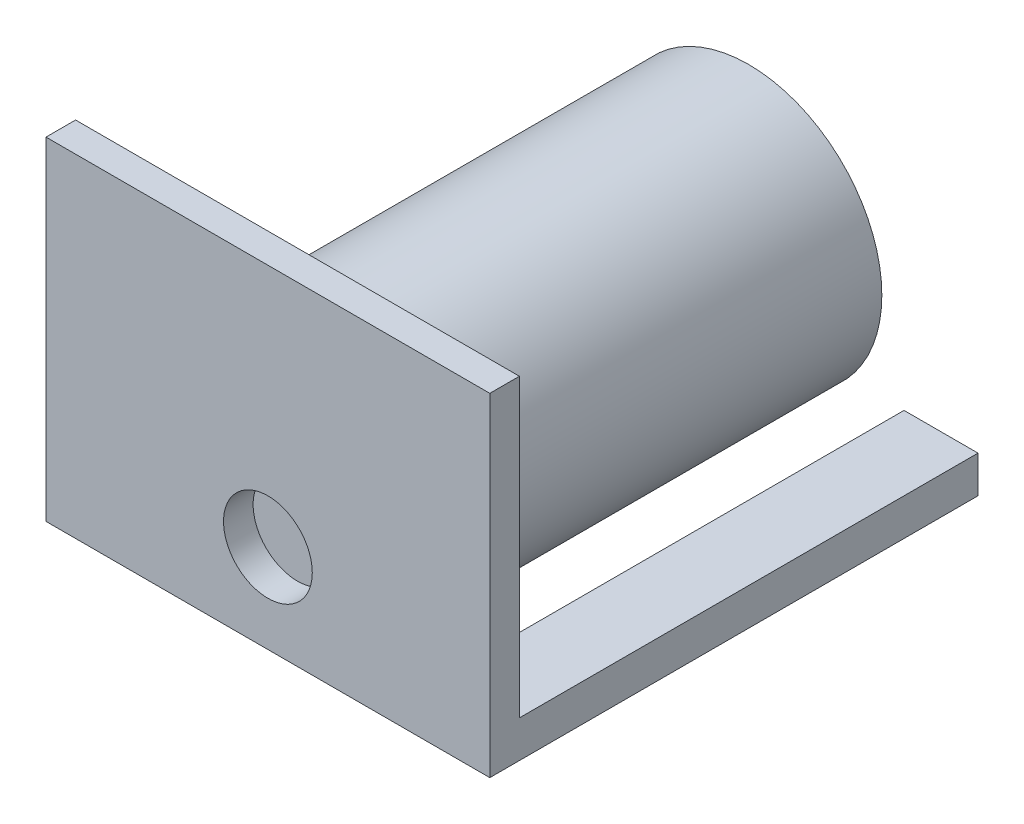
ISO-10303-21;
HEADER;
FILE_DESCRIPTION(('STEP AP214'),'2;1');
FILE_NAME('part.step','',(''),(''),'','','');
FILE_SCHEMA(('AUTOMOTIVE_DESIGN { 1 0 10303 214 1 1 1 1 }'));
ENDSEC;
DATA;
#1=APPLICATION_CONTEXT('core data for automotive mechanical design processes');
#2=APPLICATION_PROTOCOL_DEFINITION('international standard','automotive_design',2000,#1);
#3=PRODUCT_CONTEXT('',#1,'mechanical');
#4=PRODUCT('Part','Part','',(#3));
#5=PRODUCT_RELATED_PRODUCT_CATEGORY('part','',(#4));
#6=PRODUCT_DEFINITION_FORMATION('','',#4);
#7=PRODUCT_DEFINITION_CONTEXT('part definition',#1,'design');
#8=PRODUCT_DEFINITION('design','',#6,#7);
#9=PRODUCT_DEFINITION_SHAPE('','',#8);
#10=(LENGTH_UNIT() NAMED_UNIT(*) SI_UNIT(.MILLI.,.METRE.));
#11=(NAMED_UNIT(*) PLANE_ANGLE_UNIT() SI_UNIT($,.RADIAN.));
#12=(NAMED_UNIT(*) SI_UNIT($,.STERADIAN.) SOLID_ANGLE_UNIT());
#13=UNCERTAINTY_MEASURE_WITH_UNIT(LENGTH_MEASURE(1.E-05),#10,'distance_accuracy_value','');
#14=(GEOMETRIC_REPRESENTATION_CONTEXT(3) GLOBAL_UNCERTAINTY_ASSIGNED_CONTEXT((#13)) GLOBAL_UNIT_ASSIGNED_CONTEXT((#10,
#11,#12)) REPRESENTATION_CONTEXT('',''));
#15=CARTESIAN_POINT('',(0.,0.,0.));
#16=DIRECTION('',(0.,0.,1.));
#17=DIRECTION('',(1.,0.,0.));
#18=AXIS2_PLACEMENT_3D('',#15,#16,#17);
#19=CARTESIAN_POINT('',(0.58987661016754,-4.08957470949796,-22.323464202521));
#20=DIRECTION('',(0.,0.,1.));
#21=DIRECTION('',(1.,0.,0.));
#22=AXIS2_PLACEMENT_3D('',#19,#20,#21);
#23=PLANE('',#22);
#24=DIRECTION('',(1.,0.,0.));
#25=VECTOR('',#24,1.);
#26=CARTESIAN_POINT('',(-3.80602751744995,-7.42583689262255,-22.323464202521));
#27=LINE('',#26,#25);
#28=CARTESIAN_POINT('',(0.693972482550047,-7.42583689262255,-22.323464202521));
#29=VERTEX_POINT('',#28);
#30=CARTESIAN_POINT('',(3.69397248255005,-7.42583689262255,-22.323464202521));
#31=VERTEX_POINT('',#30);
#32=EDGE_CURVE('E58',#29,#31,#27,.T.);
#33=ORIENTED_EDGE('',*,*,#32,.F.);
#34=CARTESIAN_POINT('',(0.693972482550047,-4.72583689262255,-22.323464202521));
#35=DIRECTION('',(0.,0.,-1.));
#36=DIRECTION('',(-1.,0.,0.));
#37=AXIS2_PLACEMENT_3D('',#34,#35,#36);
#38=CIRCLE('',#37,2.7);
#39=EDGE_CURVE('E123',#29,#29,#38,.T.);
#40=ORIENTED_EDGE('',*,*,#39,.F.);
#41=CARTESIAN_POINT('',(-2.30602751744995,-7.42583689262255,-22.323464202521));
#42=VERTEX_POINT('',#41);
#43=EDGE_CURVE('E115',#42,#29,#27,.T.);
#44=ORIENTED_EDGE('',*,*,#43,.F.);
#45=DIRECTION('',(0.,-1.,0.));
#46=VECTOR('',#45,1.);
#47=CARTESIAN_POINT('',(-2.30602751744995,-7.42583689262255,-22.323464202521));
#48=LINE('',#47,#46);
#49=CARTESIAN_POINT('',(-2.30602751744995,-6.67583689262255,-22.323464202521));
#50=VERTEX_POINT('',#49);
#51=EDGE_CURVE('E214',#50,#42,#48,.T.);
#52=ORIENTED_EDGE('',*,*,#51,.F.);
#53=DIRECTION('',(1.,0.,0.));
#54=VECTOR('',#53,1.);
#55=CARTESIAN_POINT('',(-3.80602751744995,-6.67583689262255,-22.323464202521));
#56=LINE('',#55,#54);
#57=CARTESIAN_POINT('',(-3.80602751744995,-6.67583689262255,-22.323464202521));
#58=VERTEX_POINT('',#57);
#59=EDGE_CURVE('E212',#58,#50,#56,.T.);
#60=ORIENTED_EDGE('',*,*,#59,.F.);
#61=DIRECTION('',(0.,-1.,0.));
#62=VECTOR('',#61,1.);
#63=CARTESIAN_POINT('',(-3.80602751744996,-0.675836892622552,-22.323464202521));
#64=LINE('',#63,#62);
#65=CARTESIAN_POINT('',(-3.80602751744996,-0.675836892622552,-22.323464202521));
#66=VERTEX_POINT('',#65);
#67=EDGE_CURVE('E127',#66,#58,#64,.T.);
#68=ORIENTED_EDGE('',*,*,#67,.F.);
#69=DIRECTION('',(-1.,0.,0.));
#70=VECTOR('',#69,1.);
#71=CARTESIAN_POINT('',(-3.80602751744996,-0.675836892622552,-22.323464202521));
#72=LINE('',#71,#70);
#73=CARTESIAN_POINT('',(5.19397248255005,-0.675836892622552,-22.323464202521));
#74=VERTEX_POINT('',#73);
#75=EDGE_CURVE('E134',#74,#66,#72,.T.);
#76=ORIENTED_EDGE('',*,*,#75,.F.);
#77=DIRECTION('',(0.,1.,0.));
#78=VECTOR('',#77,1.);
#79=CARTESIAN_POINT('',(5.19397248255005,-0.675836892622552,-22.323464202521));
#80=LINE('',#79,#78);
#81=CARTESIAN_POINT('',(5.19397248255005,-6.67583689262255,-22.323464202521));
#82=VERTEX_POINT('',#81);
#83=EDGE_CURVE('E120',#82,#74,#80,.T.);
#84=ORIENTED_EDGE('',*,*,#83,.F.);
#85=DIRECTION('',(1.,0.,0.));
#86=VECTOR('',#85,1.);
#87=CARTESIAN_POINT('',(5.19397248255005,-6.67583689262255,-22.323464202521));
#88=LINE('',#87,#86);
#89=CARTESIAN_POINT('',(3.69397248255005,-6.67583689262255,-22.323464202521));
#90=VERTEX_POINT('',#89);
#91=EDGE_CURVE('E163',#90,#82,#88,.T.);
#92=ORIENTED_EDGE('',*,*,#91,.F.);
#93=DIRECTION('',(0.,1.,0.));
#94=VECTOR('',#93,1.);
#95=CARTESIAN_POINT('',(3.69397248255005,-7.42583689262255,-22.323464202521));
#96=LINE('',#95,#94);
#97=EDGE_CURVE('E125',#31,#90,#96,.T.);
#98=ORIENTED_EDGE('',*,*,#97,.F.);
#99=EDGE_LOOP('',(#33,#40,#44,#52,#60,#68,#76,#84,#92,#98));
#100=FACE_BOUND('',#99,.T.);
#101=ADVANCED_FACE('F37',(#100),#23,.F.);
#102=CARTESIAN_POINT('',(-3.80602751744996,-0.675836892622552,-21.723464202521));
#103=DIRECTION('',(1.,0.,0.));
#104=DIRECTION('',(0.,1.,0.));
#105=AXIS2_PLACEMENT_3D('',#102,#103,#104);
#106=PLANE('',#105);
#107=ORIENTED_EDGE('',*,*,#67,.T.);
#108=DIRECTION('',(0.,0.,1.));
#109=VECTOR('',#108,1.);
#110=CARTESIAN_POINT('',(-3.80602751744995,-6.67583689262255,-31.623464202521));
#111=LINE('',#110,#109);
#112=CARTESIAN_POINT('',(-3.80602751744995,-6.67583689262255,-31.623464202521));
#113=VERTEX_POINT('',#112);
#114=EDGE_CURVE('E168',#113,#58,#111,.T.);
#115=ORIENTED_EDGE('',*,*,#114,.F.);
#116=DIRECTION('',(0.,1.,0.));
#117=VECTOR('',#116,1.);
#118=CARTESIAN_POINT('',(-3.80602751744995,-7.42583689262255,-31.623464202521));
#119=LINE('',#118,#117);
#120=CARTESIAN_POINT('',(-3.80602751744995,-7.42583689262255,-31.623464202521));
#121=VERTEX_POINT('',#120);
#122=EDGE_CURVE('E198',#121,#113,#119,.T.);
#123=ORIENTED_EDGE('',*,*,#122,.F.);
#124=DIRECTION('',(0.,0.,-1.));
#125=VECTOR('',#124,1.);
#126=CARTESIAN_POINT('',(-3.80602751744995,-7.42583689262255,-21.723464202521));
#127=LINE('',#126,#125);
#128=CARTESIAN_POINT('',(-3.80602751744995,-7.42583689262255,-21.723464202521));
#129=VERTEX_POINT('',#128);
#130=EDGE_CURVE('E11',#129,#121,#127,.T.);
#131=ORIENTED_EDGE('',*,*,#130,.F.);
#132=DIRECTION('',(0.,-1.,0.));
#133=VECTOR('',#132,1.);
#134=CARTESIAN_POINT('',(-3.80602751744996,-0.675836892622552,-21.723464202521));
#135=LINE('',#134,#133);
#136=CARTESIAN_POINT('',(-3.80602751744996,-0.675836892622552,-21.723464202521));
#137=VERTEX_POINT('',#136);
#138=EDGE_CURVE('E136',#137,#129,#135,.T.);
#139=ORIENTED_EDGE('',*,*,#138,.F.);
#140=DIRECTION('',(0.,0.,-1.));
#141=VECTOR('',#140,1.);
#142=CARTESIAN_POINT('',(-3.80602751744996,-0.675836892622552,-21.723464202521));
#143=LINE('',#142,#141);
#144=EDGE_CURVE('E137',#137,#66,#143,.T.);
#145=ORIENTED_EDGE('',*,*,#144,.T.);
#146=EDGE_LOOP('',(#107,#115,#123,#131,#139,#145));
#147=FACE_BOUND('',#146,.T.);
#148=ADVANCED_FACE('F39',(#147),#106,.F.);
#149=CARTESIAN_POINT('',(-3.80602751744995,-7.42583689262255,-21.723464202521));
#150=DIRECTION('',(0.,1.,0.));
#151=DIRECTION('',(0.,0.,1.));
#152=AXIS2_PLACEMENT_3D('',#149,#150,#151);
#153=PLANE('',#152);
#154=ORIENTED_EDGE('',*,*,#130,.T.);
#155=DIRECTION('',(-1.,0.,0.));
#156=VECTOR('',#155,1.);
#157=CARTESIAN_POINT('',(-3.80602751744995,-7.42583689262255,-31.623464202521));
#158=LINE('',#157,#156);
#159=CARTESIAN_POINT('',(-2.30602751744995,-7.42583689262255,-31.623464202521));
#160=VERTEX_POINT('',#159);
#161=EDGE_CURVE('E200',#160,#121,#158,.T.);
#162=ORIENTED_EDGE('',*,*,#161,.F.);
#163=DIRECTION('',(0.,0.,1.));
#164=VECTOR('',#163,1.);
#165=CARTESIAN_POINT('',(-2.30602751744995,-7.42583689262255,-31.623464202521));
#166=LINE('',#165,#164);
#167=EDGE_CURVE('E52',#160,#42,#166,.T.);
#168=ORIENTED_EDGE('',*,*,#167,.T.);
#169=ORIENTED_EDGE('',*,*,#43,.T.);
#170=ORIENTED_EDGE('',*,*,#32,.T.);
#171=DIRECTION('',(0.,0.,1.));
#172=VECTOR('',#171,1.);
#173=CARTESIAN_POINT('',(3.69397248255005,-7.42583689262255,-31.623464202521));
#174=LINE('',#173,#172);
#175=CARTESIAN_POINT('',(3.69397248255005,-7.42583689262255,-31.623464202521));
#176=VERTEX_POINT('',#175);
#177=EDGE_CURVE('E129',#176,#31,#174,.T.);
#178=ORIENTED_EDGE('',*,*,#177,.F.);
#179=DIRECTION('',(-1.,0.,0.));
#180=VECTOR('',#179,1.);
#181=CARTESIAN_POINT('',(5.19397248255005,-7.42583689262255,-31.623464202521));
#182=LINE('',#181,#180);
#183=CARTESIAN_POINT('',(5.19397248255005,-7.42583689262255,-31.623464202521));
#184=VERTEX_POINT('',#183);
#185=EDGE_CURVE('E154',#184,#176,#182,.T.);
#186=ORIENTED_EDGE('',*,*,#185,.F.);
#187=DIRECTION('',(0.,0.,-1.));
#188=VECTOR('',#187,1.);
#189=CARTESIAN_POINT('',(5.19397248255005,-7.42583689262255,-21.723464202521));
#190=LINE('',#189,#188);
#191=CARTESIAN_POINT('',(5.19397248255005,-7.42583689262255,-21.723464202521));
#192=VERTEX_POINT('',#191);
#193=EDGE_CURVE('E45',#192,#184,#190,.T.);
#194=ORIENTED_EDGE('',*,*,#193,.F.);
#195=DIRECTION('',(1.,0.,0.));
#196=VECTOR('',#195,1.);
#197=CARTESIAN_POINT('',(-3.80602751744995,-7.42583689262255,-21.723464202521));
#198=LINE('',#197,#196);
#199=EDGE_CURVE('E182',#129,#192,#198,.T.);
#200=ORIENTED_EDGE('',*,*,#199,.F.);
#201=EDGE_LOOP('',(#154,#162,#168,#169,#170,#178,#186,#194,#200));
#202=FACE_BOUND('',#201,.T.);
#203=ADVANCED_FACE('F116',(#202),#153,.F.);
#204=CARTESIAN_POINT('',(5.19397248255005,-0.675836892622552,-21.723464202521));
#205=DIRECTION('',(-1.,0.,0.));
#206=DIRECTION('',(0.,-1.,0.));
#207=AXIS2_PLACEMENT_3D('',#204,#205,#206);
#208=PLANE('',#207);
#209=ORIENTED_EDGE('',*,*,#193,.T.);
#210=DIRECTION('',(0.,-1.,0.));
#211=VECTOR('',#210,1.);
#212=CARTESIAN_POINT('',(5.19397248255005,-7.42583689262255,-31.623464202521));
#213=LINE('',#212,#211);
#214=CARTESIAN_POINT('',(5.19397248255005,-6.67583689262255,-31.623464202521));
#215=VERTEX_POINT('',#214);
#216=EDGE_CURVE('E151',#215,#184,#213,.T.);
#217=ORIENTED_EDGE('',*,*,#216,.F.);
#218=DIRECTION('',(0.,0.,1.));
#219=VECTOR('',#218,1.);
#220=CARTESIAN_POINT('',(5.19397248255005,-6.67583689262255,-31.623464202521));
#221=LINE('',#220,#219);
#222=EDGE_CURVE('E173',#215,#82,#221,.T.);
#223=ORIENTED_EDGE('',*,*,#222,.T.);
#224=ORIENTED_EDGE('',*,*,#83,.T.);
#225=DIRECTION('',(0.,0.,-1.));
#226=VECTOR('',#225,1.);
#227=CARTESIAN_POINT('',(5.19397248255005,-0.675836892622552,-21.723464202521));
#228=LINE('',#227,#226);
#229=CARTESIAN_POINT('',(5.19397248255005,-0.675836892622552,-21.723464202521));
#230=VERTEX_POINT('',#229);
#231=EDGE_CURVE('E140',#230,#74,#228,.T.);
#232=ORIENTED_EDGE('',*,*,#231,.F.);
#233=DIRECTION('',(0.,1.,0.));
#234=VECTOR('',#233,1.);
#235=CARTESIAN_POINT('',(5.19397248255005,-0.675836892622552,-21.723464202521));
#236=LINE('',#235,#234);
#237=EDGE_CURVE('E153',#192,#230,#236,.T.);
#238=ORIENTED_EDGE('',*,*,#237,.F.);
#239=EDGE_LOOP('',(#209,#217,#223,#224,#232,#238));
#240=FACE_BOUND('',#239,.T.);
#241=ADVANCED_FACE('F148',(#240),#208,.F.);
#242=CARTESIAN_POINT('',(-3.80602751744996,-0.675836892622552,-21.723464202521));
#243=DIRECTION('',(0.,-1.,0.));
#244=DIRECTION('',(0.,0.,-1.));
#245=AXIS2_PLACEMENT_3D('',#242,#243,#244);
#246=PLANE('',#245);
#247=ORIENTED_EDGE('',*,*,#75,.T.);
#248=ORIENTED_EDGE('',*,*,#144,.F.);
#249=DIRECTION('',(-1.,0.,0.));
#250=VECTOR('',#249,1.);
#251=CARTESIAN_POINT('',(-3.80602751744996,-0.675836892622552,-21.723464202521));
#252=LINE('',#251,#250);
#253=EDGE_CURVE('E141',#230,#137,#252,.T.);
#254=ORIENTED_EDGE('',*,*,#253,.F.);
#255=ORIENTED_EDGE('',*,*,#231,.T.);
#256=EDGE_LOOP('',(#247,#248,#254,#255));
#257=FACE_BOUND('',#256,.T.);
#258=ADVANCED_FACE('F191',(#257),#246,.F.);
#259=CARTESIAN_POINT('',(0.58987661016754,-4.08957470949796,-21.723464202521));
#260=DIRECTION('',(0.,0.,1.));
#261=DIRECTION('',(1.,0.,0.));
#262=AXIS2_PLACEMENT_3D('',#259,#260,#261);
#263=PLANE('',#262);
#264=CARTESIAN_POINT('',(0.693972482550047,-5.62583689262255,-21.723464202521));
#265=DIRECTION('',(0.,0.,1.));
#266=DIRECTION('',(1.,0.,0.));
#267=AXIS2_PLACEMENT_3D('',#264,#265,#266);
#268=CIRCLE('',#267,0.9);
#269=CARTESIAN_POINT('',(1.59397248255005,-5.62583689262255,-21.723464202521));
#270=VERTEX_POINT('',#269);
#271=EDGE_CURVE('E350',#270,#270,#268,.T.);
#272=ORIENTED_EDGE('',*,*,#271,.F.);
#273=EDGE_LOOP('',(#272));
#274=FACE_BOUND('',#273,.T.);
#275=ORIENTED_EDGE('',*,*,#138,.T.);
#276=ORIENTED_EDGE('',*,*,#199,.T.);
#277=ORIENTED_EDGE('',*,*,#237,.T.);
#278=ORIENTED_EDGE('',*,*,#253,.T.);
#279=EDGE_LOOP('',(#275,#276,#277,#278));
#280=FACE_BOUND('',#279,.T.);
#281=ADVANCED_FACE('F187',(#274,#280),#263,.T.);
#282=CARTESIAN_POINT('',(3.69397248255005,-7.42583689262255,-31.623464202521));
#283=DIRECTION('',(1.,0.,0.));
#284=DIRECTION('',(0.,0.,-1.));
#285=AXIS2_PLACEMENT_3D('',#282,#283,#284);
#286=PLANE('',#285);
#287=ORIENTED_EDGE('',*,*,#97,.T.);
#288=DIRECTION('',(0.,0.,1.));
#289=VECTOR('',#288,1.);
#290=CARTESIAN_POINT('',(3.69397248255005,-6.67583689262255,-31.623464202521));
#291=LINE('',#290,#289);
#292=CARTESIAN_POINT('',(3.69397248255005,-6.67583689262255,-31.623464202521));
#293=VERTEX_POINT('',#292);
#294=EDGE_CURVE('E176',#293,#90,#291,.T.);
#295=ORIENTED_EDGE('',*,*,#294,.F.);
#296=DIRECTION('',(0.,1.,0.));
#297=VECTOR('',#296,1.);
#298=CARTESIAN_POINT('',(3.69397248255005,-7.42583689262255,-31.623464202521));
#299=LINE('',#298,#297);
#300=EDGE_CURVE('E157',#176,#293,#299,.T.);
#301=ORIENTED_EDGE('',*,*,#300,.F.);
#302=ORIENTED_EDGE('',*,*,#177,.T.);
#303=EDGE_LOOP('',(#287,#295,#301,#302));
#304=FACE_BOUND('',#303,.T.);
#305=ADVANCED_FACE('F262',(#304),#286,.F.);
#306=CARTESIAN_POINT('',(5.19397248255005,-6.67583689262255,-31.623464202521));
#307=DIRECTION('',(0.,-1.,0.));
#308=DIRECTION('',(0.,0.,-1.));
#309=AXIS2_PLACEMENT_3D('',#306,#307,#308);
#310=PLANE('',#309);
#311=ORIENTED_EDGE('',*,*,#91,.T.);
#312=ORIENTED_EDGE('',*,*,#222,.F.);
#313=DIRECTION('',(1.,0.,0.));
#314=VECTOR('',#313,1.);
#315=CARTESIAN_POINT('',(5.19397248255005,-6.67583689262255,-31.623464202521));
#316=LINE('',#315,#314);
#317=EDGE_CURVE('E161',#293,#215,#316,.T.);
#318=ORIENTED_EDGE('',*,*,#317,.F.);
#319=ORIENTED_EDGE('',*,*,#294,.T.);
#320=EDGE_LOOP('',(#311,#312,#318,#319));
#321=FACE_BOUND('',#320,.T.);
#322=ADVANCED_FACE('F269',(#321),#310,.F.);
#323=CARTESIAN_POINT('',(0.58987661016754,-4.08957470949796,-31.623464202521));
#324=DIRECTION('',(0.,0.,1.));
#325=DIRECTION('',(1.,0.,0.));
#326=AXIS2_PLACEMENT_3D('',#323,#324,#325);
#327=PLANE('',#326);
#328=ORIENTED_EDGE('',*,*,#216,.T.);
#329=ORIENTED_EDGE('',*,*,#185,.T.);
#330=ORIENTED_EDGE('',*,*,#300,.T.);
#331=ORIENTED_EDGE('',*,*,#317,.T.);
#332=EDGE_LOOP('',(#328,#329,#330,#331));
#333=FACE_BOUND('',#332,.T.);
#334=ADVANCED_FACE('F159',(#333),#327,.F.);
#335=CARTESIAN_POINT('',(-3.80602751744995,-6.67583689262255,-31.623464202521));
#336=DIRECTION('',(0.,-1.,0.));
#337=DIRECTION('',(0.,0.,-1.));
#338=AXIS2_PLACEMENT_3D('',#335,#336,#337);
#339=PLANE('',#338);
#340=ORIENTED_EDGE('',*,*,#59,.T.);
#341=DIRECTION('',(0.,0.,1.));
#342=VECTOR('',#341,1.);
#343=CARTESIAN_POINT('',(-2.30602751744995,-6.67583689262255,-31.623464202521));
#344=LINE('',#343,#342);
#345=CARTESIAN_POINT('',(-2.30602751744995,-6.67583689262255,-31.623464202521));
#346=VERTEX_POINT('',#345);
#347=EDGE_CURVE('E206',#346,#50,#344,.T.);
#348=ORIENTED_EDGE('',*,*,#347,.F.);
#349=DIRECTION('',(1.,0.,0.));
#350=VECTOR('',#349,1.);
#351=CARTESIAN_POINT('',(-3.80602751744995,-6.67583689262255,-31.623464202521));
#352=LINE('',#351,#350);
#353=EDGE_CURVE('E208',#113,#346,#352,.T.);
#354=ORIENTED_EDGE('',*,*,#353,.F.);
#355=ORIENTED_EDGE('',*,*,#114,.T.);
#356=EDGE_LOOP('',(#340,#348,#354,#355));
#357=FACE_BOUND('',#356,.T.);
#358=ADVANCED_FACE('F221',(#357),#339,.F.);
#359=CARTESIAN_POINT('',(-2.30602751744995,-7.42583689262255,-31.623464202521));
#360=DIRECTION('',(-1.,0.,0.));
#361=DIRECTION('',(0.,0.,1.));
#362=AXIS2_PLACEMENT_3D('',#359,#360,#361);
#363=PLANE('',#362);
#364=ORIENTED_EDGE('',*,*,#51,.T.);
#365=ORIENTED_EDGE('',*,*,#167,.F.);
#366=DIRECTION('',(0.,-1.,0.));
#367=VECTOR('',#366,1.);
#368=CARTESIAN_POINT('',(-2.30602751744995,-7.42583689262255,-31.623464202521));
#369=LINE('',#368,#367);
#370=EDGE_CURVE('E204',#346,#160,#369,.T.);
#371=ORIENTED_EDGE('',*,*,#370,.F.);
#372=ORIENTED_EDGE('',*,*,#347,.T.);
#373=EDGE_LOOP('',(#364,#365,#371,#372));
#374=FACE_BOUND('',#373,.T.);
#375=ADVANCED_FACE('F222',(#374),#363,.F.);
#376=CARTESIAN_POINT('',(0.58987661016754,-4.08957470949796,-31.623464202521));
#377=DIRECTION('',(0.,0.,-1.));
#378=DIRECTION('',(-1.,0.,0.));
#379=AXIS2_PLACEMENT_3D('',#376,#377,#378);
#380=PLANE('',#379);
#381=ORIENTED_EDGE('',*,*,#122,.T.);
#382=ORIENTED_EDGE('',*,*,#353,.T.);
#383=ORIENTED_EDGE('',*,*,#370,.T.);
#384=ORIENTED_EDGE('',*,*,#161,.T.);
#385=EDGE_LOOP('',(#381,#382,#383,#384));
#386=FACE_BOUND('',#385,.T.);
#387=ADVANCED_FACE('F202',(#386),#380,.T.);
#388=CARTESIAN_POINT('',(0.693972482550047,-4.72583689262255,-31.473464202521));
#389=DIRECTION('',(0.,0.,1.));
#390=DIRECTION('',(1.,0.,0.));
#391=AXIS2_PLACEMENT_3D('',#388,#389,#390);
#392=CYLINDRICAL_SURFACE('',#391,2.7);
#393=CARTESIAN_POINT('',(0.693972482550047,-4.72583689262255,-31.473464202521));
#394=DIRECTION('',(0.,0.,-1.));
#395=DIRECTION('',(-1.,0.,0.));
#396=AXIS2_PLACEMENT_3D('',#393,#394,#395);
#397=CIRCLE('',#396,2.7);
#398=CARTESIAN_POINT('',(-2.00602751744995,-4.72583689262255,-31.473464202521));
#399=VERTEX_POINT('',#398);
#400=EDGE_CURVE('E215',#399,#399,#397,.T.);
#401=ORIENTED_EDGE('',*,*,#400,.F.);
#402=EDGE_LOOP('',(#401));
#403=FACE_BOUND('',#402,.T.);
#404=ORIENTED_EDGE('',*,*,#39,.T.);
#405=EDGE_LOOP('',(#404));
#406=FACE_BOUND('',#405,.T.);
#407=ADVANCED_FACE('F229',(#403,#406),#392,.T.);
#408=CARTESIAN_POINT('',(0.693972482550047,-4.72583689262255,-31.473464202521));
#409=DIRECTION('',(0.,0.,-1.));
#410=DIRECTION('',(-1.,0.,0.));
#411=AXIS2_PLACEMENT_3D('',#408,#409,#410);
#412=PLANE('',#411);
#413=ORIENTED_EDGE('',*,*,#400,.T.);
#414=EDGE_LOOP('',(#413));
#415=FACE_BOUND('',#414,.T.);
#416=ADVANCED_FACE('F307',(#415),#412,.T.);
#417=CARTESIAN_POINT('',(0.693972482550047,-5.62583689262255,-22.323464202521));
#418=DIRECTION('',(0.,0.,1.));
#419=DIRECTION('',(1.,0.,0.));
#420=AXIS2_PLACEMENT_3D('',#417,#418,#419);
#421=CYLINDRICAL_SURFACE('',#420,0.9);
#422=CARTESIAN_POINT('',(0.693972482550047,-5.62583689262255,-22.323464202521));
#423=DIRECTION('',(0.,0.,1.));
#424=DIRECTION('',(1.,0.,0.));
#425=AXIS2_PLACEMENT_3D('',#422,#423,#424);
#426=CIRCLE('',#425,0.9);
#427=CARTESIAN_POINT('',(1.59397248255005,-5.62583689262255,-22.323464202521));
#428=VERTEX_POINT('',#427);
#429=EDGE_CURVE('E349',#428,#428,#426,.T.);
#430=ORIENTED_EDGE('',*,*,#429,.F.);
#431=EDGE_LOOP('',(#430));
#432=FACE_BOUND('',#431,.T.);
#433=ORIENTED_EDGE('',*,*,#271,.T.);
#434=EDGE_LOOP('',(#433));
#435=FACE_BOUND('',#434,.T.);
#436=ADVANCED_FACE('F317',(#432,#435),#421,.F.);
#437=CARTESIAN_POINT('',(0.58987661016754,-4.08957470949796,-22.323464202521));
#438=DIRECTION('',(0.,0.,1.));
#439=DIRECTION('',(1.,0.,0.));
#440=AXIS2_PLACEMENT_3D('',#437,#438,#439);
#441=PLANE('',#440);
#442=ORIENTED_EDGE('',*,*,#429,.T.);
#443=EDGE_LOOP('',(#442));
#444=FACE_BOUND('',#443,.T.);
#445=ADVANCED_FACE('F327',(#444),#441,.T.);
#446=CLOSED_SHELL('',(#101,#148,#203,#241,#258,#281,#305,#322,#334,#358,#375,#387,#407,#416,
#436,#445));
#447=MANIFOLD_SOLID_BREP('B2',#446);
#448=ADVANCED_BREP_SHAPE_REPRESENTATION('',(#18,#447),#14);
#449=SHAPE_DEFINITION_REPRESENTATION(#9,#448);
ENDSEC;
END-ISO-10303-21;
